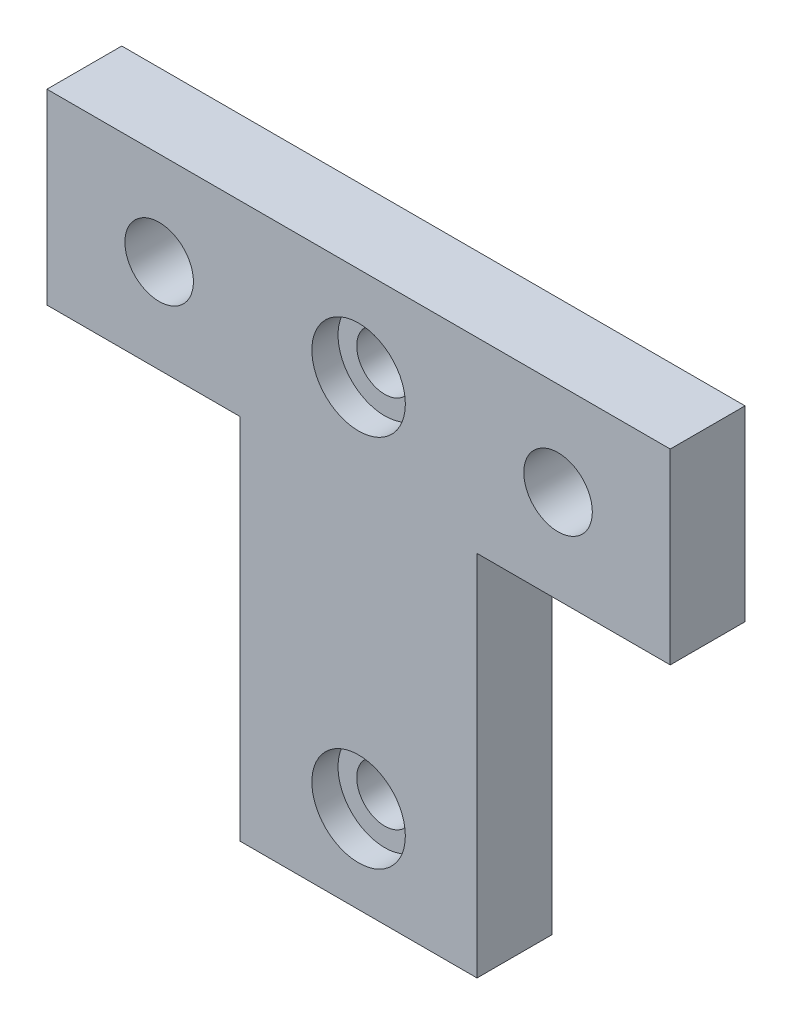
ISO-10303-21;
HEADER;
FILE_DESCRIPTION(('STEP AP214'),'2;1');
FILE_NAME('part.step','',(''),(''),'','','');
FILE_SCHEMA(('AUTOMOTIVE_DESIGN { 1 0 10303 214 1 1 1 1 }'));
ENDSEC;
DATA;
#1=APPLICATION_CONTEXT('core data for automotive mechanical design processes');
#2=APPLICATION_PROTOCOL_DEFINITION('international standard','automotive_design',2000,#1);
#3=PRODUCT_CONTEXT('',#1,'mechanical');
#4=PRODUCT('Part','Part','',(#3));
#5=PRODUCT_RELATED_PRODUCT_CATEGORY('part','',(#4));
#6=PRODUCT_DEFINITION_FORMATION('','',#4);
#7=PRODUCT_DEFINITION_CONTEXT('part definition',#1,'design');
#8=PRODUCT_DEFINITION('design','',#6,#7);
#9=PRODUCT_DEFINITION_SHAPE('','',#8);
#10=(LENGTH_UNIT() NAMED_UNIT(*) SI_UNIT(.MILLI.,.METRE.));
#11=(NAMED_UNIT(*) PLANE_ANGLE_UNIT() SI_UNIT($,.RADIAN.));
#12=(NAMED_UNIT(*) SI_UNIT($,.STERADIAN.) SOLID_ANGLE_UNIT());
#13=UNCERTAINTY_MEASURE_WITH_UNIT(LENGTH_MEASURE(1.E-05),#10,'distance_accuracy_value','');
#14=(GEOMETRIC_REPRESENTATION_CONTEXT(3) GLOBAL_UNCERTAINTY_ASSIGNED_CONTEXT((#13)) GLOBAL_UNIT_ASSIGNED_CONTEXT((#10,
#11,#12)) REPRESENTATION_CONTEXT('',''));
#15=CARTESIAN_POINT('',(0.,0.,0.));
#16=DIRECTION('',(0.,0.,1.));
#17=DIRECTION('',(1.,0.,0.));
#18=AXIS2_PLACEMENT_3D('',#15,#16,#17);
#19=CARTESIAN_POINT('',(0.,0.,6.));
#20=DIRECTION('',(0.,0.,-1.));
#21=DIRECTION('',(-1.,0.,0.));
#22=AXIS2_PLACEMENT_3D('',#19,#20,#21);
#23=CYLINDRICAL_SURFACE('',#22,2.25);
#24=CARTESIAN_POINT('',(0.,0.,0.));
#25=DIRECTION('',(0.,0.,1.));
#26=DIRECTION('',(1.,0.,0.));
#27=AXIS2_PLACEMENT_3D('',#24,#25,#26);
#28=CIRCLE('',#27,2.25);
#29=CARTESIAN_POINT('',(2.25,0.,0.));
#30=VERTEX_POINT('',#29);
#31=EDGE_CURVE('E145',#30,#30,#28,.T.);
#32=ORIENTED_EDGE('',*,*,#31,.F.);
#33=EDGE_LOOP('',(#32));
#34=FACE_BOUND('',#33,.T.);
#35=CARTESIAN_POINT('',(0.,0.,3.9));
#36=DIRECTION('',(0.,0.,1.));
#37=DIRECTION('',(1.,0.,0.));
#38=AXIS2_PLACEMENT_3D('',#35,#36,#37);
#39=CIRCLE('',#38,2.25);
#40=CARTESIAN_POINT('',(2.25,0.,3.9));
#41=VERTEX_POINT('',#40);
#42=EDGE_CURVE('E48',#41,#41,#39,.T.);
#43=ORIENTED_EDGE('',*,*,#42,.T.);
#44=EDGE_LOOP('',(#43));
#45=FACE_BOUND('',#44,.T.);
#46=ADVANCED_FACE('F45',(#34,#45),#23,.F.);
#47=CARTESIAN_POINT('',(0.,-30.,6.));
#48=DIRECTION('',(0.,0.,-1.));
#49=DIRECTION('',(-1.,0.,0.));
#50=AXIS2_PLACEMENT_3D('',#47,#48,#49);
#51=CYLINDRICAL_SURFACE('',#50,2.25);
#52=CARTESIAN_POINT('',(0.,-30.,0.));
#53=DIRECTION('',(0.,0.,1.));
#54=DIRECTION('',(1.,0.,0.));
#55=AXIS2_PLACEMENT_3D('',#52,#53,#54);
#56=CIRCLE('',#55,2.25);
#57=CARTESIAN_POINT('',(2.25,-30.,0.));
#58=VERTEX_POINT('',#57);
#59=EDGE_CURVE('E168',#58,#58,#56,.T.);
#60=ORIENTED_EDGE('',*,*,#59,.F.);
#61=EDGE_LOOP('',(#60));
#62=FACE_BOUND('',#61,.T.);
#63=CARTESIAN_POINT('',(0.,-30.,3.9));
#64=DIRECTION('',(0.,0.,1.));
#65=DIRECTION('',(1.,0.,0.));
#66=AXIS2_PLACEMENT_3D('',#63,#64,#65);
#67=CIRCLE('',#66,2.25);
#68=CARTESIAN_POINT('',(2.25,-30.,3.9));
#69=VERTEX_POINT('',#68);
#70=EDGE_CURVE('E182',#69,#69,#67,.T.);
#71=ORIENTED_EDGE('',*,*,#70,.T.);
#72=EDGE_LOOP('',(#71));
#73=FACE_BOUND('',#72,.T.);
#74=ADVANCED_FACE('F243',(#62,#73),#51,.F.);
#75=CARTESIAN_POINT('',(0.,7.5,6.));
#76=DIRECTION('',(0.,-1.,0.));
#77=DIRECTION('',(0.,0.,-1.));
#78=AXIS2_PLACEMENT_3D('',#75,#76,#77);
#79=PLANE('',#78);
#80=DIRECTION('',(-1.,0.,0.));
#81=VECTOR('',#80,1.);
#82=CARTESIAN_POINT('',(0.,7.5,0.));
#83=LINE('',#82,#81);
#84=CARTESIAN_POINT('',(25.,7.5,0.));
#85=VERTEX_POINT('',#84);
#86=CARTESIAN_POINT('',(-25.,7.5,0.));
#87=VERTEX_POINT('',#86);
#88=EDGE_CURVE('E154',#85,#87,#83,.T.);
#89=ORIENTED_EDGE('',*,*,#88,.T.);
#90=DIRECTION('',(0.,0.,-1.));
#91=VECTOR('',#90,1.);
#92=CARTESIAN_POINT('',(-25.,7.5,6.));
#93=LINE('',#92,#91);
#94=CARTESIAN_POINT('',(-25.,7.5,6.));
#95=VERTEX_POINT('',#94);
#96=EDGE_CURVE('E11',#95,#87,#93,.T.);
#97=ORIENTED_EDGE('',*,*,#96,.F.);
#98=DIRECTION('',(-1.,0.,0.));
#99=VECTOR('',#98,1.);
#100=CARTESIAN_POINT('',(0.,7.5,6.));
#101=LINE('',#100,#99);
#102=CARTESIAN_POINT('',(25.,7.5,6.));
#103=VERTEX_POINT('',#102);
#104=EDGE_CURVE('E207',#103,#95,#101,.T.);
#105=ORIENTED_EDGE('',*,*,#104,.F.);
#106=DIRECTION('',(0.,0.,-1.));
#107=VECTOR('',#106,1.);
#108=CARTESIAN_POINT('',(25.,7.5,6.));
#109=LINE('',#108,#107);
#110=EDGE_CURVE('E144',#103,#85,#109,.T.);
#111=ORIENTED_EDGE('',*,*,#110,.T.);
#112=EDGE_LOOP('',(#89,#97,#105,#111));
#113=FACE_BOUND('',#112,.T.);
#114=ADVANCED_FACE('F226',(#113),#79,.F.);
#115=CARTESIAN_POINT('',(-25.,0.,6.));
#116=DIRECTION('',(1.,0.,0.));
#117=DIRECTION('',(0.,0.,-1.));
#118=AXIS2_PLACEMENT_3D('',#115,#116,#117);
#119=PLANE('',#118);
#120=DIRECTION('',(0.,-1.,0.));
#121=VECTOR('',#120,1.);
#122=CARTESIAN_POINT('',(-25.,0.,0.));
#123=LINE('',#122,#121);
#124=CARTESIAN_POINT('',(-25.,-7.5,0.));
#125=VERTEX_POINT('',#124);
#126=EDGE_CURVE('E157',#87,#125,#123,.T.);
#127=ORIENTED_EDGE('',*,*,#126,.T.);
#128=DIRECTION('',(0.,0.,-1.));
#129=VECTOR('',#128,1.);
#130=CARTESIAN_POINT('',(-25.,-7.5,6.));
#131=LINE('',#130,#129);
#132=CARTESIAN_POINT('',(-25.,-7.5,6.));
#133=VERTEX_POINT('',#132);
#134=EDGE_CURVE('E54',#133,#125,#131,.T.);
#135=ORIENTED_EDGE('',*,*,#134,.F.);
#136=DIRECTION('',(0.,-1.,0.));
#137=VECTOR('',#136,1.);
#138=CARTESIAN_POINT('',(-25.,0.,6.));
#139=LINE('',#138,#137);
#140=EDGE_CURVE('E105',#95,#133,#139,.T.);
#141=ORIENTED_EDGE('',*,*,#140,.F.);
#142=ORIENTED_EDGE('',*,*,#96,.T.);
#143=EDGE_LOOP('',(#127,#135,#141,#142));
#144=FACE_BOUND('',#143,.T.);
#145=ADVANCED_FACE('F291',(#144),#119,.F.);
#146=CARTESIAN_POINT('',(0.,-7.5,6.));
#147=DIRECTION('',(0.,1.,0.));
#148=DIRECTION('',(0.,0.,1.));
#149=AXIS2_PLACEMENT_3D('',#146,#147,#148);
#150=PLANE('',#149);
#151=DIRECTION('',(1.,0.,0.));
#152=VECTOR('',#151,1.);
#153=CARTESIAN_POINT('',(0.,-7.5,0.));
#154=LINE('',#153,#152);
#155=CARTESIAN_POINT('',(-9.5,-7.5,0.));
#156=VERTEX_POINT('',#155);
#157=EDGE_CURVE('E159',#125,#156,#154,.T.);
#158=ORIENTED_EDGE('',*,*,#157,.T.);
#159=DIRECTION('',(0.,0.,-1.));
#160=VECTOR('',#159,1.);
#161=CARTESIAN_POINT('',(-9.5,-7.5,6.));
#162=LINE('',#161,#160);
#163=CARTESIAN_POINT('',(-9.5,-7.5,6.));
#164=VERTEX_POINT('',#163);
#165=EDGE_CURVE('E178',#164,#156,#162,.T.);
#166=ORIENTED_EDGE('',*,*,#165,.F.);
#167=DIRECTION('',(1.,0.,0.));
#168=VECTOR('',#167,1.);
#169=CARTESIAN_POINT('',(0.,-7.5,6.));
#170=LINE('',#169,#168);
#171=EDGE_CURVE('E133',#133,#164,#170,.T.);
#172=ORIENTED_EDGE('',*,*,#171,.F.);
#173=ORIENTED_EDGE('',*,*,#134,.T.);
#174=EDGE_LOOP('',(#158,#166,#172,#173));
#175=FACE_BOUND('',#174,.T.);
#176=ADVANCED_FACE('F240',(#175),#150,.F.);
#177=CARTESIAN_POINT('',(-9.50000000000001,0.,6.));
#178=DIRECTION('',(1.,0.,0.));
#179=DIRECTION('',(0.,1.,0.));
#180=AXIS2_PLACEMENT_3D('',#177,#178,#179);
#181=PLANE('',#180);
#182=DIRECTION('',(0.,-1.,0.));
#183=VECTOR('',#182,1.);
#184=CARTESIAN_POINT('',(-9.50000000000001,0.,0.));
#185=LINE('',#184,#183);
#186=CARTESIAN_POINT('',(-9.5,-37.,0.));
#187=VERTEX_POINT('',#186);
#188=EDGE_CURVE('E161',#156,#187,#185,.T.);
#189=ORIENTED_EDGE('',*,*,#188,.T.);
#190=DIRECTION('',(0.,0.,-1.));
#191=VECTOR('',#190,1.);
#192=CARTESIAN_POINT('',(-9.5,-37.,6.));
#193=LINE('',#192,#191);
#194=CARTESIAN_POINT('',(-9.5,-37.,6.));
#195=VERTEX_POINT('',#194);
#196=EDGE_CURVE('E175',#195,#187,#193,.T.);
#197=ORIENTED_EDGE('',*,*,#196,.F.);
#198=DIRECTION('',(0.,-1.,0.));
#199=VECTOR('',#198,1.);
#200=CARTESIAN_POINT('',(-9.50000000000001,0.,6.));
#201=LINE('',#200,#199);
#202=EDGE_CURVE('E139',#164,#195,#201,.T.);
#203=ORIENTED_EDGE('',*,*,#202,.F.);
#204=ORIENTED_EDGE('',*,*,#165,.T.);
#205=EDGE_LOOP('',(#189,#197,#203,#204));
#206=FACE_BOUND('',#205,.T.);
#207=ADVANCED_FACE('F214',(#206),#181,.F.);
#208=CARTESIAN_POINT('',(0.,-37.,6.));
#209=DIRECTION('',(0.,1.,0.));
#210=DIRECTION('',(0.,0.,1.));
#211=AXIS2_PLACEMENT_3D('',#208,#209,#210);
#212=PLANE('',#211);
#213=DIRECTION('',(1.,0.,0.));
#214=VECTOR('',#213,1.);
#215=CARTESIAN_POINT('',(0.,-37.,0.));
#216=LINE('',#215,#214);
#217=CARTESIAN_POINT('',(9.5,-37.,0.));
#218=VERTEX_POINT('',#217);
#219=EDGE_CURVE('E163',#187,#218,#216,.T.);
#220=ORIENTED_EDGE('',*,*,#219,.T.);
#221=DIRECTION('',(0.,0.,-1.));
#222=VECTOR('',#221,1.);
#223=CARTESIAN_POINT('',(9.5,-37.,6.));
#224=LINE('',#223,#222);
#225=CARTESIAN_POINT('',(9.5,-37.,6.));
#226=VERTEX_POINT('',#225);
#227=EDGE_CURVE('E127',#226,#218,#224,.T.);
#228=ORIENTED_EDGE('',*,*,#227,.F.);
#229=DIRECTION('',(1.,0.,0.));
#230=VECTOR('',#229,1.);
#231=CARTESIAN_POINT('',(0.,-37.,6.));
#232=LINE('',#231,#230);
#233=EDGE_CURVE('E136',#195,#226,#232,.T.);
#234=ORIENTED_EDGE('',*,*,#233,.F.);
#235=ORIENTED_EDGE('',*,*,#196,.T.);
#236=EDGE_LOOP('',(#220,#228,#234,#235));
#237=FACE_BOUND('',#236,.T.);
#238=ADVANCED_FACE('F218',(#237),#212,.F.);
#239=CARTESIAN_POINT('',(9.50000000000001,0.,6.));
#240=DIRECTION('',(1.,0.,0.));
#241=DIRECTION('',(0.,1.,0.));
#242=AXIS2_PLACEMENT_3D('',#239,#240,#241);
#243=PLANE('',#242);
#244=DIRECTION('',(0.,-1.,0.));
#245=VECTOR('',#244,1.);
#246=CARTESIAN_POINT('',(9.50000000000001,0.,0.));
#247=LINE('',#246,#245);
#248=CARTESIAN_POINT('',(9.5,-7.5,0.));
#249=VERTEX_POINT('',#248);
#250=EDGE_CURVE('E126',#249,#218,#247,.T.);
#251=ORIENTED_EDGE('',*,*,#250,.F.);
#252=DIRECTION('',(0.,0.,-1.));
#253=VECTOR('',#252,1.);
#254=CARTESIAN_POINT('',(9.5,-7.5,6.));
#255=LINE('',#254,#253);
#256=CARTESIAN_POINT('',(9.5,-7.5,6.));
#257=VERTEX_POINT('',#256);
#258=EDGE_CURVE('E120',#257,#249,#255,.T.);
#259=ORIENTED_EDGE('',*,*,#258,.F.);
#260=DIRECTION('',(0.,-1.,0.));
#261=VECTOR('',#260,1.);
#262=CARTESIAN_POINT('',(9.50000000000001,0.,6.));
#263=LINE('',#262,#261);
#264=EDGE_CURVE('E124',#257,#226,#263,.T.);
#265=ORIENTED_EDGE('',*,*,#264,.T.);
#266=ORIENTED_EDGE('',*,*,#227,.T.);
#267=EDGE_LOOP('',(#251,#259,#265,#266));
#268=FACE_BOUND('',#267,.T.);
#269=ADVANCED_FACE('F122',(#268),#243,.T.);
#270=CARTESIAN_POINT('',(25.,-7.5,0.));
#271=VERTEX_POINT('',#270);
#272=EDGE_CURVE('E91',#249,#271,#154,.T.);
#273=ORIENTED_EDGE('',*,*,#272,.T.);
#274=DIRECTION('',(0.,0.,-1.));
#275=VECTOR('',#274,1.);
#276=CARTESIAN_POINT('',(25.,-7.5,6.));
#277=LINE('',#276,#275);
#278=CARTESIAN_POINT('',(25.,-7.5,6.));
#279=VERTEX_POINT('',#278);
#280=EDGE_CURVE('E128',#279,#271,#277,.T.);
#281=ORIENTED_EDGE('',*,*,#280,.F.);
#282=EDGE_CURVE('E130',#257,#279,#170,.T.);
#283=ORIENTED_EDGE('',*,*,#282,.F.);
#284=ORIENTED_EDGE('',*,*,#258,.T.);
#285=EDGE_LOOP('',(#273,#281,#283,#284));
#286=FACE_BOUND('',#285,.T.);
#287=ADVANCED_FACE('F131',(#286),#150,.F.);
#288=CARTESIAN_POINT('',(25.,0.,6.));
#289=DIRECTION('',(-1.,0.,0.));
#290=DIRECTION('',(0.,0.,1.));
#291=AXIS2_PLACEMENT_3D('',#288,#289,#290);
#292=PLANE('',#291);
#293=DIRECTION('',(0.,1.,0.));
#294=VECTOR('',#293,1.);
#295=CARTESIAN_POINT('',(25.,0.,0.));
#296=LINE('',#295,#294);
#297=EDGE_CURVE('E97',#271,#85,#296,.T.);
#298=ORIENTED_EDGE('',*,*,#297,.T.);
#299=ORIENTED_EDGE('',*,*,#110,.F.);
#300=DIRECTION('',(0.,1.,0.));
#301=VECTOR('',#300,1.);
#302=CARTESIAN_POINT('',(25.,0.,6.));
#303=LINE('',#302,#301);
#304=EDGE_CURVE('E63',#279,#103,#303,.T.);
#305=ORIENTED_EDGE('',*,*,#304,.F.);
#306=ORIENTED_EDGE('',*,*,#280,.T.);
#307=EDGE_LOOP('',(#298,#299,#305,#306));
#308=FACE_BOUND('',#307,.T.);
#309=ADVANCED_FACE('F228',(#308),#292,.F.);
#310=CARTESIAN_POINT('',(16.,0.,6.));
#311=DIRECTION('',(0.,0.,-1.));
#312=DIRECTION('',(-1.,0.,0.));
#313=AXIS2_PLACEMENT_3D('',#310,#311,#312);
#314=CYLINDRICAL_SURFACE('',#313,2.75);
#315=CARTESIAN_POINT('',(16.,0.,6.));
#316=DIRECTION('',(0.,0.,1.));
#317=DIRECTION('',(1.,0.,0.));
#318=AXIS2_PLACEMENT_3D('',#315,#316,#317);
#319=CIRCLE('',#318,2.75);
#320=CARTESIAN_POINT('',(18.75,0.,6.));
#321=VERTEX_POINT('',#320);
#322=EDGE_CURVE('E204',#321,#321,#319,.T.);
#323=ORIENTED_EDGE('',*,*,#322,.T.);
#324=EDGE_LOOP('',(#323));
#325=FACE_BOUND('',#324,.T.);
#326=CARTESIAN_POINT('',(16.,0.,0.));
#327=DIRECTION('',(0.,0.,1.));
#328=DIRECTION('',(1.,0.,0.));
#329=AXIS2_PLACEMENT_3D('',#326,#327,#328);
#330=CIRCLE('',#329,2.75);
#331=CARTESIAN_POINT('',(18.75,0.,0.));
#332=VERTEX_POINT('',#331);
#333=EDGE_CURVE('E151',#332,#332,#330,.T.);
#334=ORIENTED_EDGE('',*,*,#333,.F.);
#335=EDGE_LOOP('',(#334));
#336=FACE_BOUND('',#335,.T.);
#337=ADVANCED_FACE('F230',(#325,#336),#314,.F.);
#338=CARTESIAN_POINT('',(-16.,0.,6.));
#339=DIRECTION('',(0.,0.,-1.));
#340=DIRECTION('',(-1.,0.,0.));
#341=AXIS2_PLACEMENT_3D('',#338,#339,#340);
#342=CYLINDRICAL_SURFACE('',#341,2.75);
#343=CARTESIAN_POINT('',(-16.,0.,6.));
#344=DIRECTION('',(0.,0.,1.));
#345=DIRECTION('',(1.,0.,0.));
#346=AXIS2_PLACEMENT_3D('',#343,#344,#345);
#347=CIRCLE('',#346,2.75);
#348=CARTESIAN_POINT('',(-13.25,0.,6.));
#349=VERTEX_POINT('',#348);
#350=EDGE_CURVE('E171',#349,#349,#347,.T.);
#351=ORIENTED_EDGE('',*,*,#350,.T.);
#352=EDGE_LOOP('',(#351));
#353=FACE_BOUND('',#352,.T.);
#354=CARTESIAN_POINT('',(-16.,0.,0.));
#355=DIRECTION('',(0.,0.,1.));
#356=DIRECTION('',(1.,0.,0.));
#357=AXIS2_PLACEMENT_3D('',#354,#355,#356);
#358=CIRCLE('',#357,2.75);
#359=CARTESIAN_POINT('',(-13.25,0.,0.));
#360=VERTEX_POINT('',#359);
#361=EDGE_CURVE('E148',#360,#360,#358,.T.);
#362=ORIENTED_EDGE('',*,*,#361,.F.);
#363=EDGE_LOOP('',(#362));
#364=FACE_BOUND('',#363,.T.);
#365=ADVANCED_FACE('F236',(#353,#364),#342,.F.);
#366=CARTESIAN_POINT('',(0.,0.,6.));
#367=DIRECTION('',(0.,0.,1.));
#368=DIRECTION('',(1.,0.,0.));
#369=AXIS2_PLACEMENT_3D('',#366,#367,#368);
#370=PLANE('',#369);
#371=CARTESIAN_POINT('',(0.,0.,6.));
#372=DIRECTION('',(0.,0.,1.));
#373=DIRECTION('',(1.,0.,0.));
#374=AXIS2_PLACEMENT_3D('',#371,#372,#373);
#375=CIRCLE('',#374,3.75);
#376=CARTESIAN_POINT('',(3.75,0.,6.));
#377=VERTEX_POINT('',#376);
#378=EDGE_CURVE('E189',#377,#377,#375,.T.);
#379=ORIENTED_EDGE('',*,*,#378,.F.);
#380=EDGE_LOOP('',(#379));
#381=FACE_BOUND('',#380,.T.);
#382=CARTESIAN_POINT('',(0.,-30.,6.));
#383=DIRECTION('',(0.,0.,1.));
#384=DIRECTION('',(1.,0.,0.));
#385=AXIS2_PLACEMENT_3D('',#382,#383,#384);
#386=CIRCLE('',#385,3.75);
#387=CARTESIAN_POINT('',(3.75,-30.,6.));
#388=VERTEX_POINT('',#387);
#389=EDGE_CURVE('E194',#388,#388,#386,.T.);
#390=ORIENTED_EDGE('',*,*,#389,.F.);
#391=EDGE_LOOP('',(#390));
#392=FACE_BOUND('',#391,.T.);
#393=ORIENTED_EDGE('',*,*,#350,.F.);
#394=EDGE_LOOP('',(#393));
#395=FACE_BOUND('',#394,.T.);
#396=ORIENTED_EDGE('',*,*,#322,.F.);
#397=EDGE_LOOP('',(#396));
#398=FACE_BOUND('',#397,.T.);
#399=ORIENTED_EDGE('',*,*,#104,.T.);
#400=ORIENTED_EDGE('',*,*,#140,.T.);
#401=ORIENTED_EDGE('',*,*,#171,.T.);
#402=ORIENTED_EDGE('',*,*,#202,.T.);
#403=ORIENTED_EDGE('',*,*,#233,.T.);
#404=ORIENTED_EDGE('',*,*,#264,.F.);
#405=ORIENTED_EDGE('',*,*,#282,.T.);
#406=ORIENTED_EDGE('',*,*,#304,.T.);
#407=EDGE_LOOP('',(#399,#400,#401,#402,#403,#404,#405,#406));
#408=FACE_BOUND('',#407,.T.);
#409=ADVANCED_FACE('F134',(#381,#392,#395,#398,#408),#370,.T.);
#410=CARTESIAN_POINT('',(0.,0.,0.));
#411=DIRECTION('',(0.,0.,1.));
#412=DIRECTION('',(1.,0.,0.));
#413=AXIS2_PLACEMENT_3D('',#410,#411,#412);
#414=PLANE('',#413);
#415=ORIENTED_EDGE('',*,*,#31,.T.);
#416=EDGE_LOOP('',(#415));
#417=FACE_BOUND('',#416,.T.);
#418=ORIENTED_EDGE('',*,*,#361,.T.);
#419=EDGE_LOOP('',(#418));
#420=FACE_BOUND('',#419,.T.);
#421=ORIENTED_EDGE('',*,*,#333,.T.);
#422=EDGE_LOOP('',(#421));
#423=FACE_BOUND('',#422,.T.);
#424=ORIENTED_EDGE('',*,*,#88,.F.);
#425=ORIENTED_EDGE('',*,*,#297,.F.);
#426=ORIENTED_EDGE('',*,*,#272,.F.);
#427=ORIENTED_EDGE('',*,*,#250,.T.);
#428=ORIENTED_EDGE('',*,*,#219,.F.);
#429=ORIENTED_EDGE('',*,*,#188,.F.);
#430=ORIENTED_EDGE('',*,*,#157,.F.);
#431=ORIENTED_EDGE('',*,*,#126,.F.);
#432=EDGE_LOOP('',(#424,#425,#426,#427,#428,#429,#430,#431));
#433=FACE_BOUND('',#432,.T.);
#434=ORIENTED_EDGE('',*,*,#59,.T.);
#435=EDGE_LOOP('',(#434));
#436=FACE_BOUND('',#435,.T.);
#437=ADVANCED_FACE('F221',(#417,#420,#423,#433,#436),#414,.F.);
#438=CARTESIAN_POINT('',(0.,-30.,3.9));
#439=DIRECTION('',(0.,0.,1.));
#440=DIRECTION('',(1.,0.,0.));
#441=AXIS2_PLACEMENT_3D('',#438,#439,#440);
#442=CYLINDRICAL_SURFACE('',#441,3.75);
#443=CARTESIAN_POINT('',(0.,-30.,3.9));
#444=DIRECTION('',(0.,0.,1.));
#445=DIRECTION('',(1.,0.,0.));
#446=AXIS2_PLACEMENT_3D('',#443,#444,#445);
#447=CIRCLE('',#446,3.75);
#448=CARTESIAN_POINT('',(3.75,-30.,3.9));
#449=VERTEX_POINT('',#448);
#450=EDGE_CURVE('E199',#449,#449,#447,.T.);
#451=ORIENTED_EDGE('',*,*,#450,.F.);
#452=EDGE_LOOP('',(#451));
#453=FACE_BOUND('',#452,.T.);
#454=ORIENTED_EDGE('',*,*,#389,.T.);
#455=EDGE_LOOP('',(#454));
#456=FACE_BOUND('',#455,.T.);
#457=ADVANCED_FACE('F265',(#453,#456),#442,.F.);
#458=CARTESIAN_POINT('',(0.,-30.,3.9));
#459=DIRECTION('',(0.,0.,1.));
#460=DIRECTION('',(1.,0.,0.));
#461=AXIS2_PLACEMENT_3D('',#458,#459,#460);
#462=PLANE('',#461);
#463=ORIENTED_EDGE('',*,*,#70,.F.);
#464=EDGE_LOOP('',(#463));
#465=FACE_BOUND('',#464,.T.);
#466=ORIENTED_EDGE('',*,*,#450,.T.);
#467=EDGE_LOOP('',(#466));
#468=FACE_BOUND('',#467,.T.);
#469=ADVANCED_FACE('F261',(#465,#468),#462,.T.);
#470=CARTESIAN_POINT('',(0.,0.,3.9));
#471=DIRECTION('',(0.,0.,1.));
#472=DIRECTION('',(1.,0.,0.));
#473=AXIS2_PLACEMENT_3D('',#470,#471,#472);
#474=CYLINDRICAL_SURFACE('',#473,3.75);
#475=CARTESIAN_POINT('',(0.,0.,3.9));
#476=DIRECTION('',(0.,0.,1.));
#477=DIRECTION('',(1.,0.,0.));
#478=AXIS2_PLACEMENT_3D('',#475,#476,#477);
#479=CIRCLE('',#478,3.75);
#480=CARTESIAN_POINT('',(3.75,0.,3.9));
#481=VERTEX_POINT('',#480);
#482=EDGE_CURVE('E184',#481,#481,#479,.T.);
#483=ORIENTED_EDGE('',*,*,#482,.F.);
#484=EDGE_LOOP('',(#483));
#485=FACE_BOUND('',#484,.T.);
#486=ORIENTED_EDGE('',*,*,#378,.T.);
#487=EDGE_LOOP('',(#486));
#488=FACE_BOUND('',#487,.T.);
#489=ADVANCED_FACE('F256',(#485,#488),#474,.F.);
#490=CARTESIAN_POINT('',(0.,0.,3.9));
#491=DIRECTION('',(0.,0.,1.));
#492=DIRECTION('',(1.,0.,0.));
#493=AXIS2_PLACEMENT_3D('',#490,#491,#492);
#494=PLANE('',#493);
#495=ORIENTED_EDGE('',*,*,#42,.F.);
#496=EDGE_LOOP('',(#495));
#497=FACE_BOUND('',#496,.T.);
#498=ORIENTED_EDGE('',*,*,#482,.T.);
#499=EDGE_LOOP('',(#498));
#500=FACE_BOUND('',#499,.T.);
#501=ADVANCED_FACE('F254',(#497,#500),#494,.T.);
#502=CLOSED_SHELL('',(#46,#74,#114,#145,#176,#207,#238,#269,#287,#309,#337,#365,#409,#437,#457,
#469,#489,#501));
#503=MANIFOLD_SOLID_BREP('B2',#502);
#504=ADVANCED_BREP_SHAPE_REPRESENTATION('',(#18,#503),#14);
#505=SHAPE_DEFINITION_REPRESENTATION(#9,#504);
ENDSEC;
END-ISO-10303-21;
